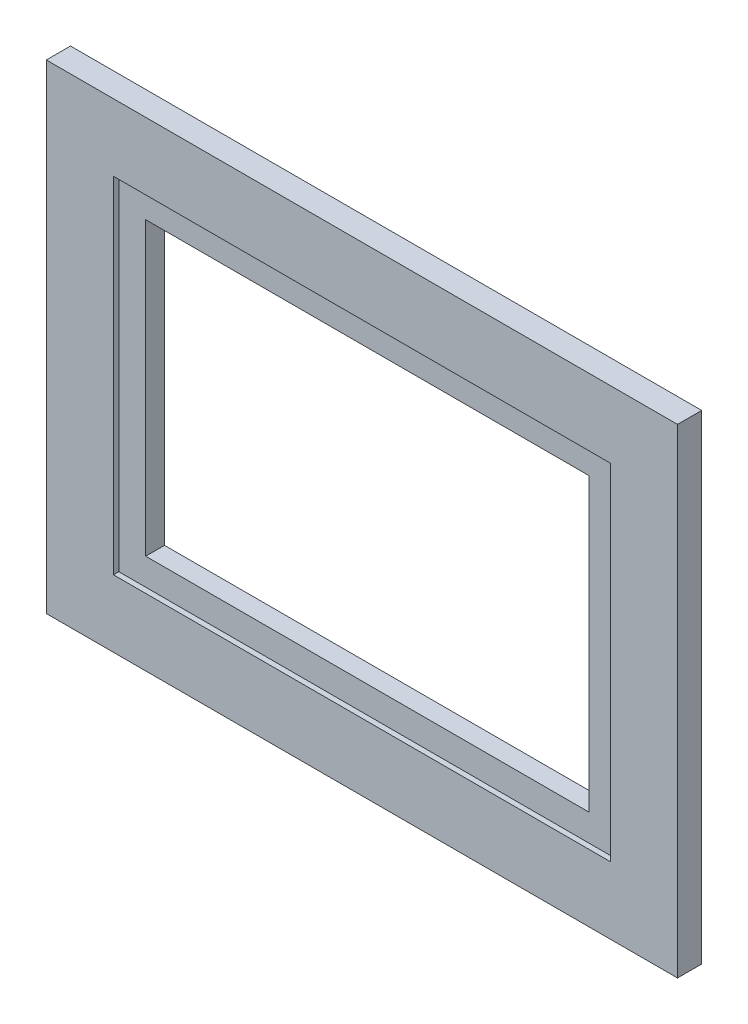
ISO-10303-21;
HEADER;
FILE_DESCRIPTION(('STEP AP214'),'2;1');
FILE_NAME('part.step','',(''),(''),'','','');
FILE_SCHEMA(('AUTOMOTIVE_DESIGN { 1 0 10303 214 1 1 1 1 }'));
ENDSEC;
DATA;
#1=APPLICATION_CONTEXT('core data for automotive mechanical design processes');
#2=APPLICATION_PROTOCOL_DEFINITION('international standard','automotive_design',2000,#1);
#3=PRODUCT_CONTEXT('',#1,'mechanical');
#4=PRODUCT('Part','Part','',(#3));
#5=PRODUCT_RELATED_PRODUCT_CATEGORY('part','',(#4));
#6=PRODUCT_DEFINITION_FORMATION('','',#4);
#7=PRODUCT_DEFINITION_CONTEXT('part definition',#1,'design');
#8=PRODUCT_DEFINITION('design','',#6,#7);
#9=PRODUCT_DEFINITION_SHAPE('','',#8);
#10=(LENGTH_UNIT() NAMED_UNIT(*) SI_UNIT(.MILLI.,.METRE.));
#11=(NAMED_UNIT(*) PLANE_ANGLE_UNIT() SI_UNIT($,.RADIAN.));
#12=(NAMED_UNIT(*) SI_UNIT($,.STERADIAN.) SOLID_ANGLE_UNIT());
#13=UNCERTAINTY_MEASURE_WITH_UNIT(LENGTH_MEASURE(1.E-05),#10,'distance_accuracy_value','');
#14=(GEOMETRIC_REPRESENTATION_CONTEXT(3) GLOBAL_UNCERTAINTY_ASSIGNED_CONTEXT((#13)) GLOBAL_UNIT_ASSIGNED_CONTEXT((#10,
#11,#12)) REPRESENTATION_CONTEXT('',''));
#15=CARTESIAN_POINT('',(0.,0.,0.));
#16=DIRECTION('',(0.,0.,1.));
#17=DIRECTION('',(1.,0.,0.));
#18=AXIS2_PLACEMENT_3D('',#15,#16,#17);
#19=CARTESIAN_POINT('',(0.,0.,18.));
#20=DIRECTION('',(1.,0.,0.));
#21=DIRECTION('',(0.,0.,-1.));
#22=AXIS2_PLACEMENT_3D('',#19,#20,#21);
#23=PLANE('',#22);
#24=DIRECTION('',(0.,-1.,0.));
#25=VECTOR('',#24,1.);
#26=CARTESIAN_POINT('',(0.,0.,0.));
#27=LINE('',#26,#25);
#28=CARTESIAN_POINT('',(0.,357.,0.));
#29=VERTEX_POINT('',#28);
#30=CARTESIAN_POINT('',(0.,0.,0.));
#31=VERTEX_POINT('',#30);
#32=EDGE_CURVE('E185',#29,#31,#27,.T.);
#33=ORIENTED_EDGE('',*,*,#32,.T.);
#34=DIRECTION('',(0.,0.,-1.));
#35=VECTOR('',#34,1.);
#36=CARTESIAN_POINT('',(0.,0.,18.));
#37=LINE('',#36,#35);
#38=CARTESIAN_POINT('',(0.,0.,18.));
#39=VERTEX_POINT('',#38);
#40=EDGE_CURVE('E11',#39,#31,#37,.T.);
#41=ORIENTED_EDGE('',*,*,#40,.F.);
#42=DIRECTION('',(0.,-1.,0.));
#43=VECTOR('',#42,1.);
#44=CARTESIAN_POINT('',(0.,0.,18.));
#45=LINE('',#44,#43);
#46=CARTESIAN_POINT('',(0.,357.,18.));
#47=VERTEX_POINT('',#46);
#48=EDGE_CURVE('E192',#47,#39,#45,.T.);
#49=ORIENTED_EDGE('',*,*,#48,.F.);
#50=DIRECTION('',(0.,0.,-1.));
#51=VECTOR('',#50,1.);
#52=CARTESIAN_POINT('',(0.,357.,18.));
#53=LINE('',#52,#51);
#54=EDGE_CURVE('E202',#47,#29,#53,.T.);
#55=ORIENTED_EDGE('',*,*,#54,.T.);
#56=EDGE_LOOP('',(#33,#41,#49,#55));
#57=FACE_BOUND('',#56,.T.);
#58=ADVANCED_FACE('F34',(#57),#23,.F.);
#59=CARTESIAN_POINT('',(0.,0.,18.));
#60=DIRECTION('',(0.,1.,0.));
#61=DIRECTION('',(0.,0.,1.));
#62=AXIS2_PLACEMENT_3D('',#59,#60,#61);
#63=PLANE('',#62);
#64=DIRECTION('',(1.,0.,0.));
#65=VECTOR('',#64,1.);
#66=CARTESIAN_POINT('',(0.,0.,0.));
#67=LINE('',#66,#65);
#68=CARTESIAN_POINT('',(470.,0.,0.));
#69=VERTEX_POINT('',#68);
#70=EDGE_CURVE('E205',#31,#69,#67,.T.);
#71=ORIENTED_EDGE('',*,*,#70,.T.);
#72=DIRECTION('',(0.,0.,-1.));
#73=VECTOR('',#72,1.);
#74=CARTESIAN_POINT('',(470.,0.,18.));
#75=LINE('',#74,#73);
#76=CARTESIAN_POINT('',(470.,0.,18.));
#77=VERTEX_POINT('',#76);
#78=EDGE_CURVE('E41',#77,#69,#75,.T.);
#79=ORIENTED_EDGE('',*,*,#78,.F.);
#80=DIRECTION('',(1.,0.,0.));
#81=VECTOR('',#80,1.);
#82=CARTESIAN_POINT('',(0.,0.,18.));
#83=LINE('',#82,#81);
#84=EDGE_CURVE('E195',#39,#77,#83,.T.);
#85=ORIENTED_EDGE('',*,*,#84,.F.);
#86=ORIENTED_EDGE('',*,*,#40,.T.);
#87=EDGE_LOOP('',(#71,#79,#85,#86));
#88=FACE_BOUND('',#87,.T.);
#89=ADVANCED_FACE('F233',(#88),#63,.F.);
#90=CARTESIAN_POINT('',(470.,0.,18.));
#91=DIRECTION('',(-1.,0.,0.));
#92=DIRECTION('',(0.,0.,1.));
#93=AXIS2_PLACEMENT_3D('',#90,#91,#92);
#94=PLANE('',#93);
#95=DIRECTION('',(0.,1.,0.));
#96=VECTOR('',#95,1.);
#97=CARTESIAN_POINT('',(470.,0.,0.));
#98=LINE('',#97,#96);
#99=CARTESIAN_POINT('',(470.,357.,0.));
#100=VERTEX_POINT('',#99);
#101=EDGE_CURVE('E207',#69,#100,#98,.T.);
#102=ORIENTED_EDGE('',*,*,#101,.T.);
#103=DIRECTION('',(0.,0.,-1.));
#104=VECTOR('',#103,1.);
#105=CARTESIAN_POINT('',(470.,357.,18.));
#106=LINE('',#105,#104);
#107=CARTESIAN_POINT('',(470.,357.,18.));
#108=VERTEX_POINT('',#107);
#109=EDGE_CURVE('E212',#108,#100,#106,.T.);
#110=ORIENTED_EDGE('',*,*,#109,.F.);
#111=DIRECTION('',(0.,1.,0.));
#112=VECTOR('',#111,1.);
#113=CARTESIAN_POINT('',(470.,0.,18.));
#114=LINE('',#113,#112);
#115=EDGE_CURVE('E198',#77,#108,#114,.T.);
#116=ORIENTED_EDGE('',*,*,#115,.F.);
#117=ORIENTED_EDGE('',*,*,#78,.T.);
#118=EDGE_LOOP('',(#102,#110,#116,#117));
#119=FACE_BOUND('',#118,.T.);
#120=ADVANCED_FACE('F219',(#119),#94,.F.);
#121=CARTESIAN_POINT('',(0.,357.,18.));
#122=DIRECTION('',(0.,-1.,0.));
#123=DIRECTION('',(0.,0.,-1.));
#124=AXIS2_PLACEMENT_3D('',#121,#122,#123);
#125=PLANE('',#124);
#126=DIRECTION('',(-1.,0.,0.));
#127=VECTOR('',#126,1.);
#128=CARTESIAN_POINT('',(0.,357.,0.));
#129=LINE('',#128,#127);
#130=EDGE_CURVE('E196',#100,#29,#129,.T.);
#131=ORIENTED_EDGE('',*,*,#130,.T.);
#132=ORIENTED_EDGE('',*,*,#54,.F.);
#133=DIRECTION('',(-1.,0.,0.));
#134=VECTOR('',#133,1.);
#135=CARTESIAN_POINT('',(0.,357.,18.));
#136=LINE('',#135,#134);
#137=EDGE_CURVE('E200',#108,#47,#136,.T.);
#138=ORIENTED_EDGE('',*,*,#137,.F.);
#139=ORIENTED_EDGE('',*,*,#109,.T.);
#140=EDGE_LOOP('',(#131,#132,#138,#139));
#141=FACE_BOUND('',#140,.T.);
#142=ADVANCED_FACE('F226',(#141),#125,.F.);
#143=CARTESIAN_POINT('',(0.,0.,18.));
#144=DIRECTION('',(0.,0.,-1.));
#145=DIRECTION('',(-1.,0.,0.));
#146=AXIS2_PLACEMENT_3D('',#143,#144,#145);
#147=PLANE('',#146);
#148=DIRECTION('',(0.,-1.,0.));
#149=VECTOR('',#148,1.);
#150=CARTESIAN_POINT('',(50.,307.,18.));
#151=LINE('',#150,#149);
#152=CARTESIAN_POINT('',(50.,307.,18.));
#153=VERTEX_POINT('',#152);
#154=CARTESIAN_POINT('',(50.,50.,18.));
#155=VERTEX_POINT('',#154);
#156=EDGE_CURVE('E175',#153,#155,#151,.T.);
#157=ORIENTED_EDGE('',*,*,#156,.F.);
#158=DIRECTION('',(-1.,0.,0.));
#159=VECTOR('',#158,1.);
#160=CARTESIAN_POINT('',(420.,307.,18.));
#161=LINE('',#160,#159);
#162=CARTESIAN_POINT('',(420.,307.,18.));
#163=VERTEX_POINT('',#162);
#164=EDGE_CURVE('E156',#163,#153,#161,.T.);
#165=ORIENTED_EDGE('',*,*,#164,.F.);
#166=DIRECTION('',(0.,1.,0.));
#167=VECTOR('',#166,1.);
#168=CARTESIAN_POINT('',(420.,50.,18.));
#169=LINE('',#168,#167);
#170=CARTESIAN_POINT('',(420.,50.,18.));
#171=VERTEX_POINT('',#170);
#172=EDGE_CURVE('E164',#171,#163,#169,.T.);
#173=ORIENTED_EDGE('',*,*,#172,.F.);
#174=DIRECTION('',(1.,0.,0.));
#175=VECTOR('',#174,1.);
#176=CARTESIAN_POINT('',(50.,50.,18.));
#177=LINE('',#176,#175);
#178=EDGE_CURVE('E178',#155,#171,#177,.T.);
#179=ORIENTED_EDGE('',*,*,#178,.F.);
#180=EDGE_LOOP('',(#157,#165,#173,#179));
#181=FACE_BOUND('',#180,.T.);
#182=ORIENTED_EDGE('',*,*,#48,.T.);
#183=ORIENTED_EDGE('',*,*,#84,.T.);
#184=ORIENTED_EDGE('',*,*,#115,.T.);
#185=ORIENTED_EDGE('',*,*,#137,.T.);
#186=EDGE_LOOP('',(#182,#183,#184,#185));
#187=FACE_BOUND('',#186,.T.);
#188=ADVANCED_FACE('F232',(#181,#187),#147,.F.);
#189=CARTESIAN_POINT('',(0.,0.,0.));
#190=DIRECTION('',(0.,0.,-1.));
#191=DIRECTION('',(-1.,0.,0.));
#192=AXIS2_PLACEMENT_3D('',#189,#190,#191);
#193=PLANE('',#192);
#194=DIRECTION('',(0.,1.,0.));
#195=VECTOR('',#194,1.);
#196=CARTESIAN_POINT('',(400.,70.,0.));
#197=LINE('',#196,#195);
#198=CARTESIAN_POINT('',(400.,70.,0.));
#199=VERTEX_POINT('',#198);
#200=CARTESIAN_POINT('',(400.,287.,0.));
#201=VERTEX_POINT('',#200);
#202=EDGE_CURVE('E125',#199,#201,#197,.T.);
#203=ORIENTED_EDGE('',*,*,#202,.T.);
#204=DIRECTION('',(-1.,0.,0.));
#205=VECTOR('',#204,1.);
#206=CARTESIAN_POINT('',(400.,287.,0.));
#207=LINE('',#206,#205);
#208=CARTESIAN_POINT('',(70.,287.,0.));
#209=VERTEX_POINT('',#208);
#210=EDGE_CURVE('E136',#201,#209,#207,.T.);
#211=ORIENTED_EDGE('',*,*,#210,.T.);
#212=DIRECTION('',(0.,-1.,0.));
#213=VECTOR('',#212,1.);
#214=CARTESIAN_POINT('',(70.,287.,0.));
#215=LINE('',#214,#213);
#216=CARTESIAN_POINT('',(70.,70.,0.));
#217=VERTEX_POINT('',#216);
#218=EDGE_CURVE('E53',#209,#217,#215,.T.);
#219=ORIENTED_EDGE('',*,*,#218,.T.);
#220=DIRECTION('',(1.,0.,0.));
#221=VECTOR('',#220,1.);
#222=CARTESIAN_POINT('',(70.,70.,0.));
#223=LINE('',#222,#221);
#224=EDGE_CURVE('E133',#217,#199,#223,.T.);
#225=ORIENTED_EDGE('',*,*,#224,.T.);
#226=EDGE_LOOP('',(#203,#211,#219,#225));
#227=FACE_BOUND('',#226,.T.);
#228=ORIENTED_EDGE('',*,*,#32,.F.);
#229=ORIENTED_EDGE('',*,*,#130,.F.);
#230=ORIENTED_EDGE('',*,*,#101,.F.);
#231=ORIENTED_EDGE('',*,*,#70,.F.);
#232=EDGE_LOOP('',(#228,#229,#230,#231));
#233=FACE_BOUND('',#232,.T.);
#234=ADVANCED_FACE('F140',(#227,#233),#193,.T.);
#235=CARTESIAN_POINT('',(420.,307.,14.));
#236=DIRECTION('',(0.,1.,0.));
#237=DIRECTION('',(0.,0.,1.));
#238=AXIS2_PLACEMENT_3D('',#235,#236,#237);
#239=PLANE('',#238);
#240=ORIENTED_EDGE('',*,*,#164,.T.);
#241=DIRECTION('',(0.,0.,1.));
#242=VECTOR('',#241,1.);
#243=CARTESIAN_POINT('',(50.,307.,14.));
#244=LINE('',#243,#242);
#245=CARTESIAN_POINT('',(50.,307.,14.));
#246=VERTEX_POINT('',#245);
#247=EDGE_CURVE('E173',#246,#153,#244,.T.);
#248=ORIENTED_EDGE('',*,*,#247,.F.);
#249=DIRECTION('',(-1.,0.,0.));
#250=VECTOR('',#249,1.);
#251=CARTESIAN_POINT('',(420.,307.,14.));
#252=LINE('',#251,#250);
#253=CARTESIAN_POINT('',(420.,307.,14.));
#254=VERTEX_POINT('',#253);
#255=EDGE_CURVE('E160',#254,#246,#252,.T.);
#256=ORIENTED_EDGE('',*,*,#255,.F.);
#257=DIRECTION('',(0.,0.,1.));
#258=VECTOR('',#257,1.);
#259=CARTESIAN_POINT('',(420.,307.,14.));
#260=LINE('',#259,#258);
#261=EDGE_CURVE('E183',#254,#163,#260,.T.);
#262=ORIENTED_EDGE('',*,*,#261,.T.);
#263=EDGE_LOOP('',(#240,#248,#256,#262));
#264=FACE_BOUND('',#263,.T.);
#265=ADVANCED_FACE('F245',(#264),#239,.F.);
#266=CARTESIAN_POINT('',(420.,50.,14.));
#267=DIRECTION('',(1.,0.,0.));
#268=DIRECTION('',(0.,0.,-1.));
#269=AXIS2_PLACEMENT_3D('',#266,#267,#268);
#270=PLANE('',#269);
#271=ORIENTED_EDGE('',*,*,#172,.T.);
#272=ORIENTED_EDGE('',*,*,#261,.F.);
#273=DIRECTION('',(0.,1.,0.));
#274=VECTOR('',#273,1.);
#275=CARTESIAN_POINT('',(420.,50.,14.));
#276=LINE('',#275,#274);
#277=CARTESIAN_POINT('',(420.,50.,14.));
#278=VERTEX_POINT('',#277);
#279=EDGE_CURVE('E170',#278,#254,#276,.T.);
#280=ORIENTED_EDGE('',*,*,#279,.F.);
#281=DIRECTION('',(0.,0.,1.));
#282=VECTOR('',#281,1.);
#283=CARTESIAN_POINT('',(420.,50.,14.));
#284=LINE('',#283,#282);
#285=EDGE_CURVE('E186',#278,#171,#284,.T.);
#286=ORIENTED_EDGE('',*,*,#285,.T.);
#287=EDGE_LOOP('',(#271,#272,#280,#286));
#288=FACE_BOUND('',#287,.T.);
#289=ADVANCED_FACE('F251',(#288),#270,.F.);
#290=CARTESIAN_POINT('',(50.,50.,14.));
#291=DIRECTION('',(0.,-1.,0.));
#292=DIRECTION('',(0.,0.,-1.));
#293=AXIS2_PLACEMENT_3D('',#290,#291,#292);
#294=PLANE('',#293);
#295=ORIENTED_EDGE('',*,*,#178,.T.);
#296=ORIENTED_EDGE('',*,*,#285,.F.);
#297=DIRECTION('',(1.,0.,0.));
#298=VECTOR('',#297,1.);
#299=CARTESIAN_POINT('',(50.,50.,14.));
#300=LINE('',#299,#298);
#301=CARTESIAN_POINT('',(50.,50.,14.));
#302=VERTEX_POINT('',#301);
#303=EDGE_CURVE('E167',#302,#278,#300,.T.);
#304=ORIENTED_EDGE('',*,*,#303,.F.);
#305=DIRECTION('',(0.,0.,1.));
#306=VECTOR('',#305,1.);
#307=CARTESIAN_POINT('',(50.,50.,14.));
#308=LINE('',#307,#306);
#309=EDGE_CURVE('E188',#302,#155,#308,.T.);
#310=ORIENTED_EDGE('',*,*,#309,.T.);
#311=EDGE_LOOP('',(#295,#296,#304,#310));
#312=FACE_BOUND('',#311,.T.);
#313=ADVANCED_FACE('F257',(#312),#294,.F.);
#314=CARTESIAN_POINT('',(50.,307.,14.));
#315=DIRECTION('',(-1.,0.,0.));
#316=DIRECTION('',(0.,0.,1.));
#317=AXIS2_PLACEMENT_3D('',#314,#315,#316);
#318=PLANE('',#317);
#319=ORIENTED_EDGE('',*,*,#156,.T.);
#320=ORIENTED_EDGE('',*,*,#309,.F.);
#321=DIRECTION('',(0.,-1.,0.));
#322=VECTOR('',#321,1.);
#323=CARTESIAN_POINT('',(50.,307.,14.));
#324=LINE('',#323,#322);
#325=EDGE_CURVE('E163',#246,#302,#324,.T.);
#326=ORIENTED_EDGE('',*,*,#325,.F.);
#327=ORIENTED_EDGE('',*,*,#247,.T.);
#328=EDGE_LOOP('',(#319,#320,#326,#327));
#329=FACE_BOUND('',#328,.T.);
#330=ADVANCED_FACE('F253',(#329),#318,.F.);
#331=CARTESIAN_POINT('',(0.,0.,14.));
#332=DIRECTION('',(0.,0.,1.));
#333=DIRECTION('',(1.,0.,0.));
#334=AXIS2_PLACEMENT_3D('',#331,#332,#333);
#335=PLANE('',#334);
#336=DIRECTION('',(0.,1.,0.));
#337=VECTOR('',#336,1.);
#338=CARTESIAN_POINT('',(400.,70.,14.));
#339=LINE('',#338,#337);
#340=CARTESIAN_POINT('',(400.,70.,14.));
#341=VERTEX_POINT('',#340);
#342=CARTESIAN_POINT('',(400.,287.,14.));
#343=VERTEX_POINT('',#342);
#344=EDGE_CURVE('E128',#341,#343,#339,.T.);
#345=ORIENTED_EDGE('',*,*,#344,.F.);
#346=DIRECTION('',(1.,0.,0.));
#347=VECTOR('',#346,1.);
#348=CARTESIAN_POINT('',(70.,70.,14.));
#349=LINE('',#348,#347);
#350=CARTESIAN_POINT('',(70.,70.,14.));
#351=VERTEX_POINT('',#350);
#352=EDGE_CURVE('E143',#351,#341,#349,.T.);
#353=ORIENTED_EDGE('',*,*,#352,.F.);
#354=DIRECTION('',(0.,-1.,0.));
#355=VECTOR('',#354,1.);
#356=CARTESIAN_POINT('',(70.,287.,14.));
#357=LINE('',#356,#355);
#358=CARTESIAN_POINT('',(70.,287.,14.));
#359=VERTEX_POINT('',#358);
#360=EDGE_CURVE('E48',#359,#351,#357,.T.);
#361=ORIENTED_EDGE('',*,*,#360,.F.);
#362=DIRECTION('',(-1.,0.,0.));
#363=VECTOR('',#362,1.);
#364=CARTESIAN_POINT('',(400.,287.,14.));
#365=LINE('',#364,#363);
#366=EDGE_CURVE('E151',#343,#359,#365,.T.);
#367=ORIENTED_EDGE('',*,*,#366,.F.);
#368=EDGE_LOOP('',(#345,#353,#361,#367));
#369=FACE_BOUND('',#368,.T.);
#370=ORIENTED_EDGE('',*,*,#255,.T.);
#371=ORIENTED_EDGE('',*,*,#325,.T.);
#372=ORIENTED_EDGE('',*,*,#303,.T.);
#373=ORIENTED_EDGE('',*,*,#279,.T.);
#374=EDGE_LOOP('',(#370,#371,#372,#373));
#375=FACE_BOUND('',#374,.T.);
#376=ADVANCED_FACE('F256',(#369,#375),#335,.T.);
#377=CARTESIAN_POINT('',(400.,70.,0.));
#378=DIRECTION('',(1.,0.,0.));
#379=DIRECTION('',(0.,0.,-1.));
#380=AXIS2_PLACEMENT_3D('',#377,#378,#379);
#381=PLANE('',#380);
#382=ORIENTED_EDGE('',*,*,#344,.T.);
#383=DIRECTION('',(0.,0.,1.));
#384=VECTOR('',#383,1.);
#385=CARTESIAN_POINT('',(400.,287.,0.));
#386=LINE('',#385,#384);
#387=EDGE_CURVE('E121',#201,#343,#386,.T.);
#388=ORIENTED_EDGE('',*,*,#387,.F.);
#389=ORIENTED_EDGE('',*,*,#202,.F.);
#390=DIRECTION('',(0.,0.,1.));
#391=VECTOR('',#390,1.);
#392=CARTESIAN_POINT('',(400.,70.,0.));
#393=LINE('',#392,#391);
#394=EDGE_CURVE('E154',#199,#341,#393,.T.);
#395=ORIENTED_EDGE('',*,*,#394,.T.);
#396=EDGE_LOOP('',(#382,#388,#389,#395));
#397=FACE_BOUND('',#396,.T.);
#398=ADVANCED_FACE('F123',(#397),#381,.F.);
#399=CARTESIAN_POINT('',(70.,70.,0.));
#400=DIRECTION('',(0.,-1.,0.));
#401=DIRECTION('',(0.,0.,-1.));
#402=AXIS2_PLACEMENT_3D('',#399,#400,#401);
#403=PLANE('',#402);
#404=ORIENTED_EDGE('',*,*,#352,.T.);
#405=ORIENTED_EDGE('',*,*,#394,.F.);
#406=ORIENTED_EDGE('',*,*,#224,.F.);
#407=DIRECTION('',(0.,0.,1.));
#408=VECTOR('',#407,1.);
#409=CARTESIAN_POINT('',(70.,70.,0.));
#410=LINE('',#409,#408);
#411=EDGE_CURVE('E157',#217,#351,#410,.T.);
#412=ORIENTED_EDGE('',*,*,#411,.T.);
#413=EDGE_LOOP('',(#404,#405,#406,#412));
#414=FACE_BOUND('',#413,.T.);
#415=ADVANCED_FACE('F270',(#414),#403,.F.);
#416=CARTESIAN_POINT('',(70.,287.,0.));
#417=DIRECTION('',(-1.,0.,0.));
#418=DIRECTION('',(0.,0.,1.));
#419=AXIS2_PLACEMENT_3D('',#416,#417,#418);
#420=PLANE('',#419);
#421=ORIENTED_EDGE('',*,*,#360,.T.);
#422=ORIENTED_EDGE('',*,*,#411,.F.);
#423=ORIENTED_EDGE('',*,*,#218,.F.);
#424=DIRECTION('',(0.,0.,1.));
#425=VECTOR('',#424,1.);
#426=CARTESIAN_POINT('',(70.,287.,0.));
#427=LINE('',#426,#425);
#428=EDGE_CURVE('E132',#209,#359,#427,.T.);
#429=ORIENTED_EDGE('',*,*,#428,.T.);
#430=EDGE_LOOP('',(#421,#422,#423,#429));
#431=FACE_BOUND('',#430,.T.);
#432=ADVANCED_FACE('F273',(#431),#420,.F.);
#433=CARTESIAN_POINT('',(400.,287.,0.));
#434=DIRECTION('',(0.,1.,0.));
#435=DIRECTION('',(0.,0.,1.));
#436=AXIS2_PLACEMENT_3D('',#433,#434,#435);
#437=PLANE('',#436);
#438=ORIENTED_EDGE('',*,*,#366,.T.);
#439=ORIENTED_EDGE('',*,*,#428,.F.);
#440=ORIENTED_EDGE('',*,*,#210,.F.);
#441=ORIENTED_EDGE('',*,*,#387,.T.);
#442=EDGE_LOOP('',(#438,#439,#440,#441));
#443=FACE_BOUND('',#442,.T.);
#444=ADVANCED_FACE('F137',(#443),#437,.F.);
#445=CLOSED_SHELL('',(#58,#89,#120,#142,#188,#234,#265,#289,#313,#330,#376,#398,#415,#432,#444));
#446=MANIFOLD_SOLID_BREP('B2',#445);
#447=ADVANCED_BREP_SHAPE_REPRESENTATION('',(#18,#446),#14);
#448=SHAPE_DEFINITION_REPRESENTATION(#9,#447);
ENDSEC;
END-ISO-10303-21;
